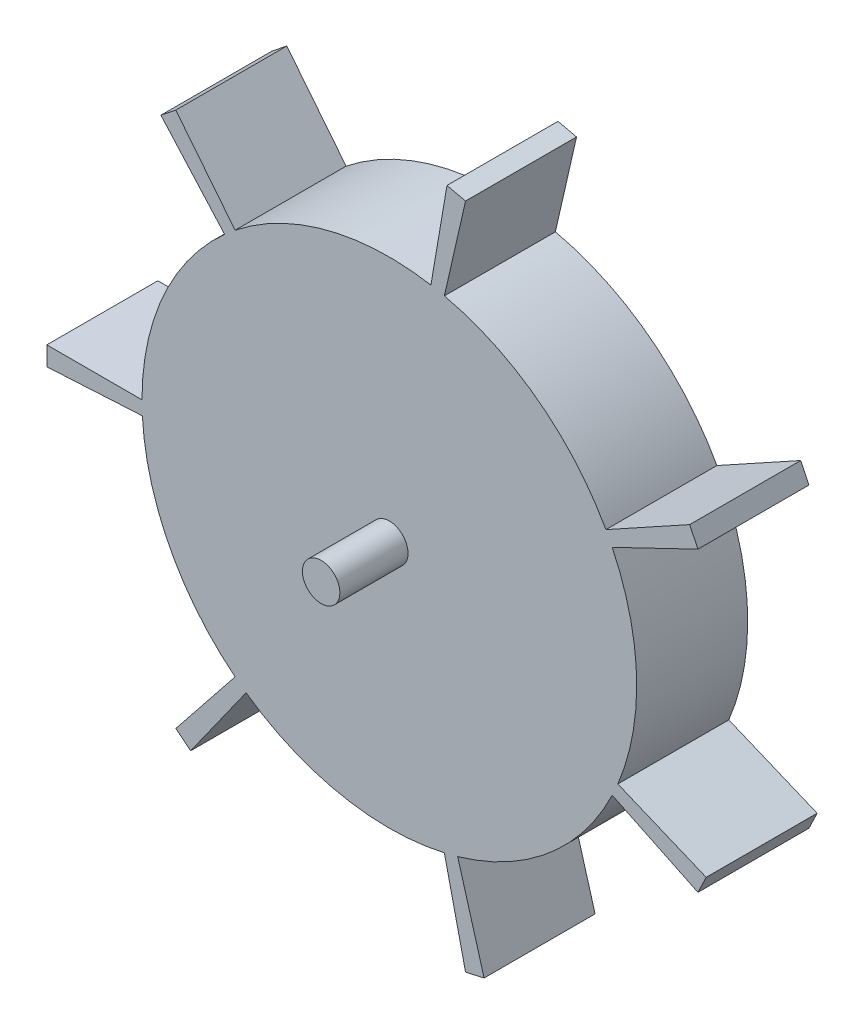
ISO-10303-21;
HEADER;
FILE_DESCRIPTION(('STEP AP214'),'2;1');
FILE_NAME('part.step','',(''),(''),'','','');
FILE_SCHEMA(('AUTOMOTIVE_DESIGN { 1 0 10303 214 1 1 1 1 }'));
ENDSEC;
DATA;
#1=APPLICATION_CONTEXT('core data for automotive mechanical design processes');
#2=APPLICATION_PROTOCOL_DEFINITION('international standard','automotive_design',2000,#1);
#3=PRODUCT_CONTEXT('',#1,'mechanical');
#4=PRODUCT('Part','Part','',(#3));
#5=PRODUCT_RELATED_PRODUCT_CATEGORY('part','',(#4));
#6=PRODUCT_DEFINITION_FORMATION('','',#4);
#7=PRODUCT_DEFINITION_CONTEXT('part definition',#1,'design');
#8=PRODUCT_DEFINITION('design','',#6,#7);
#9=PRODUCT_DEFINITION_SHAPE('','',#8);
#10=(LENGTH_UNIT() NAMED_UNIT(*) SI_UNIT(.MILLI.,.METRE.));
#11=(NAMED_UNIT(*) PLANE_ANGLE_UNIT() SI_UNIT($,.RADIAN.));
#12=(NAMED_UNIT(*) SI_UNIT($,.STERADIAN.) SOLID_ANGLE_UNIT());
#13=UNCERTAINTY_MEASURE_WITH_UNIT(LENGTH_MEASURE(1.E-05),#10,'distance_accuracy_value','');
#14=(GEOMETRIC_REPRESENTATION_CONTEXT(3) GLOBAL_UNCERTAINTY_ASSIGNED_CONTEXT((#13)) GLOBAL_UNIT_ASSIGNED_CONTEXT((#10,
#11,#12)) REPRESENTATION_CONTEXT('',''));
#15=CARTESIAN_POINT('',(0.,0.,0.));
#16=DIRECTION('',(0.,0.,1.));
#17=DIRECTION('',(1.,0.,0.));
#18=AXIS2_PLACEMENT_3D('',#15,#16,#17);
#19=CARTESIAN_POINT('',(0.,0.,-10.75));
#20=DIRECTION('',(0.,0.,1.));
#21=DIRECTION('',(1.,0.,0.));
#22=AXIS2_PLACEMENT_3D('',#19,#20,#21);
#23=PLANE('',#22);
#24=CARTESIAN_POINT('',(0.,0.,-10.75));
#25=DIRECTION('',(0.,0.,1.));
#26=DIRECTION('',(1.,0.,0.));
#27=AXIS2_PLACEMENT_3D('',#24,#25,#26);
#28=CIRCLE('',#27,2.95);
#29=CARTESIAN_POINT('',(2.95,0.,-10.75));
#30=VERTEX_POINT('',#29);
#31=EDGE_CURVE('E582',#30,#30,#28,.T.);
#32=ORIENTED_EDGE('',*,*,#31,.F.);
#33=EDGE_LOOP('',(#32));
#34=FACE_BOUND('',#33,.T.);
#35=CARTESIAN_POINT('',(0.,0.,-10.75));
#36=DIRECTION('',(0.,0.,1.));
#37=DIRECTION('',(1.,0.,0.));
#38=AXIS2_PLACEMENT_3D('',#35,#36,#37);
#39=CIRCLE('',#38,1.7);
#40=CARTESIAN_POINT('',(1.22376468326227,-1.18,-10.75));
#41=VERTEX_POINT('',#40);
#42=CARTESIAN_POINT('',(-1.22376468326227,-1.18,-10.75));
#43=VERTEX_POINT('',#42);
#44=EDGE_CURVE('E56',#41,#43,#39,.T.);
#45=ORIENTED_EDGE('',*,*,#44,.T.);
#46=DIRECTION('',(-1.,0.,0.));
#47=VECTOR('',#46,1.);
#48=CARTESIAN_POINT('',(0.,-1.18,-10.75));
#49=LINE('',#48,#47);
#50=EDGE_CURVE('E597',#41,#43,#49,.T.);
#51=ORIENTED_EDGE('',*,*,#50,.F.);
#52=EDGE_LOOP('',(#45,#51));
#53=FACE_BOUND('',#52,.T.);
#54=ADVANCED_FACE('F41',(#34,#53),#23,.F.);
#55=CARTESIAN_POINT('',(0.,0.,17.5));
#56=DIRECTION('',(0.,0.,-1.));
#57=DIRECTION('',(-1.,0.,0.));
#58=AXIS2_PLACEMENT_3D('',#55,#56,#57);
#59=CYLINDRICAL_SURFACE('',#58,39.);
#60=CARTESIAN_POINT('',(0.,0.,0.));
#61=DIRECTION('',(0.,0.,1.));
#62=DIRECTION('',(1.,0.,0.));
#63=AXIS2_PLACEMENT_3D('',#60,#61,#62);
#64=CIRCLE('',#63,39.);
#65=CARTESIAN_POINT('',(36.0223201102337,-14.9463190744763,0.));
#66=VERTEX_POINT('',#65);
#67=CARTESIAN_POINT('',(35.1377858481946,16.9214658255849,0.));
#68=VERTEX_POINT('',#67);
#69=EDGE_CURVE('E271',#66,#68,#64,.T.);
#70=ORIENTED_EDGE('',*,*,#69,.T.);
#71=DIRECTION('',(0.,0.,-1.));
#72=VECTOR('',#71,1.);
#73=CARTESIAN_POINT('',(35.1377858481946,16.9214658255849,17.5));
#74=LINE('',#73,#72);
#75=CARTESIAN_POINT('',(35.1377858481946,16.9214658255849,17.5));
#76=VERTEX_POINT('',#75);
#77=EDGE_CURVE('E49',#76,#68,#74,.T.);
#78=ORIENTED_EDGE('',*,*,#77,.F.);
#79=CARTESIAN_POINT('',(0.,0.,17.5));
#80=DIRECTION('',(0.,0.,1.));
#81=DIRECTION('',(1.,0.,0.));
#82=AXIS2_PLACEMENT_3D('',#79,#80,#81);
#83=CIRCLE('',#82,39.);
#84=CARTESIAN_POINT('',(36.0223201102337,-14.9463190744763,17.5));
#85=VERTEX_POINT('',#84);
#86=EDGE_CURVE('E321',#85,#76,#83,.T.);
#87=ORIENTED_EDGE('',*,*,#86,.F.);
#88=DIRECTION('',(0.,0.,-1.));
#89=VECTOR('',#88,1.);
#90=CARTESIAN_POINT('',(36.0223201102337,-14.9463190744763,17.5));
#91=LINE('',#90,#89);
#92=EDGE_CURVE('E267',#85,#66,#91,.T.);
#93=ORIENTED_EDGE('',*,*,#92,.T.);
#94=EDGE_LOOP('',(#70,#78,#87,#93));
#95=FACE_BOUND('',#94,.T.);
#96=ADVANCED_FACE('F397',(#95),#59,.T.);
#97=CARTESIAN_POINT('',(0.,0.,17.5));
#98=DIRECTION('',(-0.433883739117559,0.900968867902419,0.));
#99=DIRECTION('',(-0.900968867902419,-0.433883739117559,0.));
#100=AXIS2_PLACEMENT_3D('',#97,#98,#99);
#101=PLANE('',#100);
#102=DIRECTION('',(0.900968867902419,0.433883739117559,0.));
#103=VECTOR('',#102,1.);
#104=CARTESIAN_POINT('',(0.,0.,0.));
#105=LINE('',#104,#103);
#106=CARTESIAN_POINT('',(48.6523188667311,23.4297219123581,0.));
#107=VERTEX_POINT('',#106);
#108=EDGE_CURVE('E274',#68,#107,#105,.T.);
#109=ORIENTED_EDGE('',*,*,#108,.T.);
#110=DIRECTION('',(0.,0.,-1.));
#111=VECTOR('',#110,1.);
#112=CARTESIAN_POINT('',(48.6523188667311,23.4297219123581,17.5));
#113=LINE('',#112,#111);
#114=CARTESIAN_POINT('',(48.6523188667311,23.4297219123581,17.5));
#115=VERTEX_POINT('',#114);
#116=EDGE_CURVE('E391',#115,#107,#113,.T.);
#117=ORIENTED_EDGE('',*,*,#116,.F.);
#118=DIRECTION('',(0.900968867902419,0.433883739117559,0.));
#119=VECTOR('',#118,1.);
#120=CARTESIAN_POINT('',(0.,0.,17.5));
#121=LINE('',#120,#119);
#122=EDGE_CURVE('E167',#76,#115,#121,.T.);
#123=ORIENTED_EDGE('',*,*,#122,.F.);
#124=ORIENTED_EDGE('',*,*,#77,.T.);
#125=EDGE_LOOP('',(#109,#117,#123,#124));
#126=FACE_BOUND('',#125,.T.);
#127=ADVANCED_FACE('F43',(#126),#101,.F.);
#128=CARTESIAN_POINT('',(48.6523188667349,23.4297219123501,17.5));
#129=DIRECTION('',(-0.900968867902419,-0.433883739117558,0.));
#130=DIRECTION('',(0.433883739117558,-0.900968867902419,0.));
#131=AXIS2_PLACEMENT_3D('',#128,#129,#130);
#132=PLANE('',#131);
#133=DIRECTION('',(-0.433883739117558,0.900968867902419,0.));
#134=VECTOR('',#133,1.);
#135=CARTESIAN_POINT('',(48.6523188667349,23.4297219123501,0.));
#136=LINE('',#135,#134);
#137=CARTESIAN_POINT('',(47.3506676493784,26.1326285160653,0.));
#138=VERTEX_POINT('',#137);
#139=EDGE_CURVE('E279',#107,#138,#136,.T.);
#140=ORIENTED_EDGE('',*,*,#139,.T.);
#141=DIRECTION('',(0.,0.,-1.));
#142=VECTOR('',#141,1.);
#143=CARTESIAN_POINT('',(47.3506676493784,26.1326285160653,17.5));
#144=LINE('',#143,#142);
#145=CARTESIAN_POINT('',(47.3506676493784,26.1326285160653,17.5));
#146=VERTEX_POINT('',#145);
#147=EDGE_CURVE('E388',#146,#138,#144,.T.);
#148=ORIENTED_EDGE('',*,*,#147,.F.);
#149=DIRECTION('',(-0.433883739117558,0.900968867902419,0.));
#150=VECTOR('',#149,1.);
#151=CARTESIAN_POINT('',(48.6523188667349,23.4297219123501,17.5));
#152=LINE('',#151,#150);
#153=EDGE_CURVE('E414',#115,#146,#152,.T.);
#154=ORIENTED_EDGE('',*,*,#153,.F.);
#155=ORIENTED_EDGE('',*,*,#116,.T.);
#156=EDGE_LOOP('',(#140,#148,#154,#155));
#157=FACE_BOUND('',#156,.T.);
#158=ADVANCED_FACE('F405',(#157),#132,.F.);
#159=CARTESIAN_POINT('',(0.,0.,17.5));
#160=DIRECTION('',(0.483192472191232,-0.875514154550185,0.));
#161=DIRECTION('',(0.875514154550185,0.483192472191232,0.));
#162=AXIS2_PLACEMENT_3D('',#159,#160,#161);
#163=PLANE('',#162);
#164=DIRECTION('',(-0.875514154550185,-0.483192472191232,0.));
#165=VECTOR('',#164,1.);
#166=CARTESIAN_POINT('',(0.,0.,0.));
#167=LINE('',#166,#165);
#168=CARTESIAN_POINT('',(34.1450520274574,18.8445064154582,0.));
#169=VERTEX_POINT('',#168);
#170=EDGE_CURVE('E281',#138,#169,#167,.T.);
#171=ORIENTED_EDGE('',*,*,#170,.T.);
#172=DIRECTION('',(0.,0.,-1.));
#173=VECTOR('',#172,1.);
#174=CARTESIAN_POINT('',(34.1450520274574,18.8445064154582,17.5));
#175=LINE('',#174,#173);
#176=CARTESIAN_POINT('',(34.1450520274574,18.8445064154582,17.5));
#177=VERTEX_POINT('',#176);
#178=EDGE_CURVE('E385',#177,#169,#175,.T.);
#179=ORIENTED_EDGE('',*,*,#178,.F.);
#180=DIRECTION('',(-0.875514154550185,-0.483192472191232,0.));
#181=VECTOR('',#180,1.);
#182=CARTESIAN_POINT('',(0.,0.,17.5));
#183=LINE('',#182,#181);
#184=EDGE_CURVE('E411',#146,#177,#183,.T.);
#185=ORIENTED_EDGE('',*,*,#184,.F.);
#186=ORIENTED_EDGE('',*,*,#147,.T.);
#187=EDGE_LOOP('',(#171,#179,#185,#186));
#188=FACE_BOUND('',#187,.T.);
#189=ADVANCED_FACE('F409',(#188),#163,.F.);
#190=CARTESIAN_POINT('',(8.67831642429708,38.0221885750948,0.));
#191=VERTEX_POINT('',#190);
#192=EDGE_CURVE('E277',#169,#191,#64,.T.);
#193=ORIENTED_EDGE('',*,*,#192,.T.);
#194=DIRECTION('',(0.,0.,-1.));
#195=VECTOR('',#194,1.);
#196=CARTESIAN_POINT('',(8.67831642429708,38.0221885750948,17.5));
#197=LINE('',#196,#195);
#198=CARTESIAN_POINT('',(8.67831642429708,38.0221885750948,17.5));
#199=VERTEX_POINT('',#198);
#200=EDGE_CURVE('E382',#199,#191,#197,.T.);
#201=ORIENTED_EDGE('',*,*,#200,.F.);
#202=EDGE_CURVE('E413',#177,#199,#83,.T.);
#203=ORIENTED_EDGE('',*,*,#202,.F.);
#204=ORIENTED_EDGE('',*,*,#178,.T.);
#205=EDGE_LOOP('',(#193,#201,#203,#204));
#206=FACE_BOUND('',#205,.T.);
#207=ADVANCED_FACE('F556',(#206),#59,.T.);
#208=CARTESIAN_POINT('',(0.,0.,17.5));
#209=DIRECTION('',(-0.974927912181824,0.222520933956314,0.));
#210=DIRECTION('',(-0.222520933956314,-0.974927912181824,0.));
#211=AXIS2_PLACEMENT_3D('',#208,#209,#210);
#212=PLANE('',#211);
#213=DIRECTION('',(0.222520933956314,0.974927912181824,0.));
#214=VECTOR('',#213,1.);
#215=CARTESIAN_POINT('',(0.,0.,0.));
#216=LINE('',#215,#214);
#217=CARTESIAN_POINT('',(12.0161304336378,52.6461072578258,0.));
#218=VERTEX_POINT('',#217);
#219=EDGE_CURVE('E283',#191,#218,#216,.T.);
#220=ORIENTED_EDGE('',*,*,#219,.T.);
#221=DIRECTION('',(0.,0.,-1.));
#222=VECTOR('',#221,1.);
#223=CARTESIAN_POINT('',(12.0161304336378,52.6461072578258,17.5));
#224=LINE('',#223,#222);
#225=CARTESIAN_POINT('',(12.0161304336378,52.6461072578258,17.5));
#226=VERTEX_POINT('',#225);
#227=EDGE_CURVE('E379',#226,#218,#224,.T.);
#228=ORIENTED_EDGE('',*,*,#227,.F.);
#229=DIRECTION('',(0.222520933956314,0.974927912181824,0.));
#230=VECTOR('',#229,1.);
#231=CARTESIAN_POINT('',(0.,0.,17.5));
#232=LINE('',#231,#230);
#233=EDGE_CURVE('E416',#199,#226,#232,.T.);
#234=ORIENTED_EDGE('',*,*,#233,.F.);
#235=ORIENTED_EDGE('',*,*,#200,.T.);
#236=EDGE_LOOP('',(#220,#228,#234,#235));
#237=FACE_BOUND('',#236,.T.);
#238=ADVANCED_FACE('F843',(#237),#212,.F.);
#239=CARTESIAN_POINT('',(12.0161304336424,52.6461072578248,17.5));
#240=DIRECTION('',(-0.222520933956314,-0.974927912181824,0.));
#241=DIRECTION('',(0.974927912181824,-0.222520933956314,0.));
#242=AXIS2_PLACEMENT_3D('',#239,#240,#241);
#243=PLANE('',#242);
#244=DIRECTION('',(-0.974927912181824,0.222520933956314,0.));
#245=VECTOR('',#244,1.);
#246=CARTESIAN_POINT('',(12.0161304336424,52.6461072578248,0.));
#247=LINE('',#246,#245);
#248=CARTESIAN_POINT('',(9.09134669709236,53.3136700596948,0.));
#249=VERTEX_POINT('',#248);
#250=EDGE_CURVE('E285',#218,#249,#247,.T.);
#251=ORIENTED_EDGE('',*,*,#250,.T.);
#252=DIRECTION('',(0.,0.,-1.));
#253=VECTOR('',#252,1.);
#254=CARTESIAN_POINT('',(9.09134669709236,53.3136700596948,17.5));
#255=LINE('',#254,#253);
#256=CARTESIAN_POINT('',(9.09134669709236,53.3136700596948,17.5));
#257=VERTEX_POINT('',#256);
#258=EDGE_CURVE('E376',#257,#249,#255,.T.);
#259=ORIENTED_EDGE('',*,*,#258,.F.);
#260=DIRECTION('',(-0.974927912181824,0.222520933956314,0.));
#261=VECTOR('',#260,1.);
#262=CARTESIAN_POINT('',(12.0161304336424,52.6461072578248,17.5));
#263=LINE('',#262,#261);
#264=EDGE_CURVE('E423',#226,#257,#263,.T.);
#265=ORIENTED_EDGE('',*,*,#264,.F.);
#266=ORIENTED_EDGE('',*,*,#227,.T.);
#267=EDGE_LOOP('',(#251,#259,#265,#266));
#268=FACE_BOUND('',#267,.T.);
#269=ADVANCED_FACE('F832',(#268),#243,.F.);
#270=CARTESIAN_POINT('',(0.,0.,17.5));
#271=DIRECTION('',(0.985770108119858,-0.168099059894349,0.));
#272=DIRECTION('',(0.168099059894349,0.985770108119858,0.));
#273=AXIS2_PLACEMENT_3D('',#270,#271,#272);
#274=PLANE('',#273);
#275=DIRECTION('',(-0.168099059894349,-0.985770108119858,0.));
#276=VECTOR('',#275,1.);
#277=CARTESIAN_POINT('',(0.,0.,0.));
#278=LINE('',#277,#276);
#279=CARTESIAN_POINT('',(6.55586333588022,38.4450342166781,0.));
#280=VERTEX_POINT('',#279);
#281=EDGE_CURVE('E287',#249,#280,#278,.T.);
#282=ORIENTED_EDGE('',*,*,#281,.T.);
#283=DIRECTION('',(0.,0.,-1.));
#284=VECTOR('',#283,1.);
#285=CARTESIAN_POINT('',(6.55586333588022,38.4450342166781,17.5));
#286=LINE('',#285,#284);
#287=CARTESIAN_POINT('',(6.55586333588022,38.4450342166781,17.5));
#288=VERTEX_POINT('',#287);
#289=EDGE_CURVE('E373',#288,#280,#286,.T.);
#290=ORIENTED_EDGE('',*,*,#289,.F.);
#291=DIRECTION('',(-0.168099059894349,-0.985770108119858,0.));
#292=VECTOR('',#291,1.);
#293=CARTESIAN_POINT('',(0.,0.,17.5));
#294=LINE('',#293,#292);
#295=EDGE_CURVE('E425',#257,#288,#294,.T.);
#296=ORIENTED_EDGE('',*,*,#295,.F.);
#297=ORIENTED_EDGE('',*,*,#258,.T.);
#298=EDGE_LOOP('',(#282,#290,#296,#297));
#299=FACE_BOUND('',#298,.T.);
#300=ADVANCED_FACE('F823',(#299),#274,.F.);
#301=CARTESIAN_POINT('',(-24.3161022724918,30.4914278162546,0.));
#302=VERTEX_POINT('',#301);
#303=EDGE_CURVE('E289',#280,#302,#64,.T.);
#304=ORIENTED_EDGE('',*,*,#303,.T.);
#305=DIRECTION('',(0.,0.,-1.));
#306=VECTOR('',#305,1.);
#307=CARTESIAN_POINT('',(-24.3161022724918,30.4914278162546,17.5));
#308=LINE('',#307,#306);
#309=CARTESIAN_POINT('',(-24.3161022724918,30.4914278162546,17.5));
#310=VERTEX_POINT('',#309);
#311=EDGE_CURVE('E370',#310,#302,#308,.T.);
#312=ORIENTED_EDGE('',*,*,#311,.F.);
#313=EDGE_CURVE('E418',#288,#310,#83,.T.);
#314=ORIENTED_EDGE('',*,*,#313,.F.);
#315=ORIENTED_EDGE('',*,*,#289,.T.);
#316=EDGE_LOOP('',(#304,#312,#314,#315));
#317=FACE_BOUND('',#316,.T.);
#318=ADVANCED_FACE('F468',(#317),#59,.T.);
#319=CARTESIAN_POINT('',(0.,0.,17.5));
#320=DIRECTION('',(-0.781831482468029,-0.623489801858734,0.));
#321=DIRECTION('',(0.623489801858734,-0.781831482468029,0.));
#322=AXIS2_PLACEMENT_3D('',#319,#320,#321);
#323=PLANE('',#322);
#324=DIRECTION('',(-0.623489801858734,0.781831482468029,0.));
#325=VECTOR('',#324,1.);
#326=CARTESIAN_POINT('',(0.,0.,0.));
#327=LINE('',#326,#325);
#328=CARTESIAN_POINT('',(-33.668449300375,42.2189000532765,0.));
#329=VERTEX_POINT('',#328);
#330=EDGE_CURVE('E290',#302,#329,#327,.T.);
#331=ORIENTED_EDGE('',*,*,#330,.T.);
#332=DIRECTION('',(0.,0.,-1.));
#333=VECTOR('',#332,1.);
#334=CARTESIAN_POINT('',(-33.668449300375,42.2189000532765,17.5));
#335=LINE('',#334,#333);
#336=CARTESIAN_POINT('',(-33.668449300375,42.2189000532765,17.5));
#337=VERTEX_POINT('',#336);
#338=EDGE_CURVE('E367',#337,#329,#335,.T.);
#339=ORIENTED_EDGE('',*,*,#338,.F.);
#340=DIRECTION('',(-0.623489801858734,0.781831482468029,0.));
#341=VECTOR('',#340,1.);
#342=CARTESIAN_POINT('',(0.,0.,17.5));
#343=LINE('',#342,#341);
#344=EDGE_CURVE('E427',#310,#337,#343,.T.);
#345=ORIENTED_EDGE('',*,*,#344,.F.);
#346=ORIENTED_EDGE('',*,*,#311,.T.);
#347=EDGE_LOOP('',(#331,#339,#345,#346));
#348=FACE_BOUND('',#347,.T.);
#349=ADVANCED_FACE('F472',(#348),#323,.F.);
#350=CARTESIAN_POINT('',(-33.6684493003744,42.2189000532769,17.5));
#351=DIRECTION('',(0.623489801858735,-0.781831482468028,0.));
#352=DIRECTION('',(0.781831482468028,0.623489801858735,0.));
#353=AXIS2_PLACEMENT_3D('',#350,#351,#352);
#354=PLANE('',#353);
#355=DIRECTION('',(-0.781831482468028,-0.623489801858735,0.));
#356=VECTOR('',#355,1.);
#357=CARTESIAN_POINT('',(-33.6684493003744,42.2189000532769,0.));
#358=LINE('',#357,#356);
#359=CARTESIAN_POINT('',(-36.013943747779,40.3484306477003,0.));
#360=VERTEX_POINT('',#359);
#361=EDGE_CURVE('E292',#329,#360,#358,.T.);
#362=ORIENTED_EDGE('',*,*,#361,.T.);
#363=DIRECTION('',(0.,0.,-1.));
#364=VECTOR('',#363,1.);
#365=CARTESIAN_POINT('',(-36.013943747779,40.3484306477003,17.5));
#366=LINE('',#365,#364);
#367=CARTESIAN_POINT('',(-36.013943747779,40.3484306477003,17.5));
#368=VERTEX_POINT('',#367);
#369=EDGE_CURVE('E364',#368,#360,#366,.T.);
#370=ORIENTED_EDGE('',*,*,#369,.F.);
#371=DIRECTION('',(-0.781831482468028,-0.623489801858735,0.));
#372=VECTOR('',#371,1.);
#373=CARTESIAN_POINT('',(-33.6684493003744,42.2189000532769,17.5));
#374=LINE('',#373,#372);
#375=EDGE_CURVE('E429',#337,#368,#374,.T.);
#376=ORIENTED_EDGE('',*,*,#375,.F.);
#377=ORIENTED_EDGE('',*,*,#338,.T.);
#378=EDGE_LOOP('',(#362,#370,#376,#377));
#379=FACE_BOUND('',#378,.T.);
#380=ADVANCED_FACE('F477',(#379),#354,.F.);
#381=CARTESIAN_POINT('',(0.,0.,17.5));
#382=DIRECTION('',(0.746042746588593,0.665898055457852,0.));
#383=DIRECTION('',(-0.665898055457852,0.746042746588593,0.));
#384=AXIS2_PLACEMENT_3D('',#381,#382,#383);
#385=PLANE('',#384);
#386=DIRECTION('',(0.665898055457852,-0.746042746588593,0.));
#387=VECTOR('',#386,1.);
#388=CARTESIAN_POINT('',(0.,0.,0.));
#389=LINE('',#388,#387);
#390=CARTESIAN_POINT('',(-25.9700241628575,29.0956671169566,0.));
#391=VERTEX_POINT('',#390);
#392=EDGE_CURVE('E294',#360,#391,#389,.T.);
#393=ORIENTED_EDGE('',*,*,#392,.T.);
#394=DIRECTION('',(0.,0.,-1.));
#395=VECTOR('',#394,1.);
#396=CARTESIAN_POINT('',(-25.9700241628575,29.0956671169566,17.5));
#397=LINE('',#396,#395);
#398=CARTESIAN_POINT('',(-25.9700241628575,29.0956671169566,17.5));
#399=VERTEX_POINT('',#398);
#400=EDGE_CURVE('E361',#399,#391,#397,.T.);
#401=ORIENTED_EDGE('',*,*,#400,.F.);
#402=DIRECTION('',(0.665898055457852,-0.746042746588593,0.));
#403=VECTOR('',#402,1.);
#404=CARTESIAN_POINT('',(0.,0.,17.5));
#405=LINE('',#404,#403);
#406=EDGE_CURVE('E431',#368,#399,#405,.T.);
#407=ORIENTED_EDGE('',*,*,#406,.F.);
#408=ORIENTED_EDGE('',*,*,#369,.T.);
#409=EDGE_LOOP('',(#393,#401,#407,#408));
#410=FACE_BOUND('',#409,.T.);
#411=ADVANCED_FACE('F481',(#410),#385,.F.);
#412=CARTESIAN_POINT('',(-39.,0.,0.));
#413=VERTEX_POINT('',#412);
#414=EDGE_CURVE('E296',#391,#413,#64,.T.);
#415=ORIENTED_EDGE('',*,*,#414,.T.);
#416=DIRECTION('',(0.,0.,-1.));
#417=VECTOR('',#416,1.);
#418=CARTESIAN_POINT('',(-39.,0.,17.5));
#419=LINE('',#418,#417);
#420=CARTESIAN_POINT('',(-39.,0.,17.5));
#421=VERTEX_POINT('',#420);
#422=EDGE_CURVE('E358',#421,#413,#419,.T.);
#423=ORIENTED_EDGE('',*,*,#422,.F.);
#424=EDGE_CURVE('E433',#399,#421,#83,.T.);
#425=ORIENTED_EDGE('',*,*,#424,.F.);
#426=ORIENTED_EDGE('',*,*,#400,.T.);
#427=EDGE_LOOP('',(#415,#423,#425,#426));
#428=FACE_BOUND('',#427,.T.);
#429=ADVANCED_FACE('F485',(#428),#59,.T.);
#430=CARTESIAN_POINT('',(0.,0.,17.5));
#431=DIRECTION('',(0.,-1.,0.));
#432=DIRECTION('',(1.,0.,0.));
#433=AXIS2_PLACEMENT_3D('',#430,#431,#432);
#434=PLANE('',#433);
#435=DIRECTION('',(-1.,0.,0.));
#436=VECTOR('',#435,1.);
#437=CARTESIAN_POINT('',(0.,0.,0.));
#438=LINE('',#437,#436);
#439=CARTESIAN_POINT('',(-54.,0.,0.));
#440=VERTEX_POINT('',#439);
#441=EDGE_CURVE('E297',#413,#440,#438,.T.);
#442=ORIENTED_EDGE('',*,*,#441,.T.);
#443=DIRECTION('',(0.,0.,-1.));
#444=VECTOR('',#443,1.);
#445=CARTESIAN_POINT('',(-54.,0.,17.5));
#446=LINE('',#445,#444);
#447=CARTESIAN_POINT('',(-54.,0.,17.5));
#448=VERTEX_POINT('',#447);
#449=EDGE_CURVE('E355',#448,#440,#446,.T.);
#450=ORIENTED_EDGE('',*,*,#449,.F.);
#451=DIRECTION('',(-1.,0.,0.));
#452=VECTOR('',#451,1.);
#453=CARTESIAN_POINT('',(0.,0.,17.5));
#454=LINE('',#453,#452);
#455=EDGE_CURVE('E434',#421,#448,#454,.T.);
#456=ORIENTED_EDGE('',*,*,#455,.F.);
#457=ORIENTED_EDGE('',*,*,#422,.T.);
#458=EDGE_LOOP('',(#442,#450,#456,#457));
#459=FACE_BOUND('',#458,.T.);
#460=ADVANCED_FACE('F490',(#459),#434,.F.);
#461=CARTESIAN_POINT('',(-54.,0.,17.5));
#462=DIRECTION('',(1.,0.,0.));
#463=DIRECTION('',(0.,0.,-1.));
#464=AXIS2_PLACEMENT_3D('',#461,#462,#463);
#465=PLANE('',#464);
#466=DIRECTION('',(0.,-1.,0.));
#467=VECTOR('',#466,1.);
#468=CARTESIAN_POINT('',(-54.,0.,0.));
#469=LINE('',#468,#467);
#470=CARTESIAN_POINT('',(-54.,-3.,0.));
#471=VERTEX_POINT('',#470);
#472=EDGE_CURVE('E299',#440,#471,#469,.T.);
#473=ORIENTED_EDGE('',*,*,#472,.T.);
#474=DIRECTION('',(0.,0.,-1.));
#475=VECTOR('',#474,1.);
#476=CARTESIAN_POINT('',(-54.,-3.,17.5));
#477=LINE('',#476,#475);
#478=CARTESIAN_POINT('',(-54.,-3.,17.5));
#479=VERTEX_POINT('',#478);
#480=EDGE_CURVE('E352',#479,#471,#477,.T.);
#481=ORIENTED_EDGE('',*,*,#480,.F.);
#482=DIRECTION('',(0.,-1.,0.));
#483=VECTOR('',#482,1.);
#484=CARTESIAN_POINT('',(-54.,0.,17.5));
#485=LINE('',#484,#483);
#486=EDGE_CURVE('E436',#448,#479,#485,.T.);
#487=ORIENTED_EDGE('',*,*,#486,.F.);
#488=ORIENTED_EDGE('',*,*,#449,.T.);
#489=EDGE_LOOP('',(#473,#481,#487,#488));
#490=FACE_BOUND('',#489,.T.);
#491=ADVANCED_FACE('F496',(#490),#465,.F.);
#492=CARTESIAN_POINT('',(0.,0.,17.5));
#493=DIRECTION('',(-0.055470019622523,0.998460353205412,0.));
#494=DIRECTION('',(-0.998460353205412,-0.055470019622523,0.));
#495=AXIS2_PLACEMENT_3D('',#492,#493,#494);
#496=PLANE('',#495);
#497=DIRECTION('',(0.998460353205413,0.055470019622523,0.));
#498=VECTOR('',#497,1.);
#499=CARTESIAN_POINT('',(0.,0.,0.));
#500=LINE('',#499,#498);
#501=CARTESIAN_POINT('',(-38.9399537750111,-2.1633307652784,0.));
#502=VERTEX_POINT('',#501);
#503=EDGE_CURVE('E301',#471,#502,#500,.T.);
#504=ORIENTED_EDGE('',*,*,#503,.T.);
#505=DIRECTION('',(0.,0.,-1.));
#506=VECTOR('',#505,1.);
#507=CARTESIAN_POINT('',(-38.9399537750111,-2.1633307652784,17.5));
#508=LINE('',#507,#506);
#509=CARTESIAN_POINT('',(-38.9399537750111,-2.1633307652784,17.5));
#510=VERTEX_POINT('',#509);
#511=EDGE_CURVE('E349',#510,#502,#508,.T.);
#512=ORIENTED_EDGE('',*,*,#511,.F.);
#513=DIRECTION('',(0.998460353205413,0.055470019622523,0.));
#514=VECTOR('',#513,1.);
#515=CARTESIAN_POINT('',(0.,0.,17.5));
#516=LINE('',#515,#514);
#517=EDGE_CURVE('E438',#479,#510,#516,.T.);
#518=ORIENTED_EDGE('',*,*,#517,.F.);
#519=ORIENTED_EDGE('',*,*,#480,.T.);
#520=EDGE_LOOP('',(#504,#512,#518,#519));
#521=FACE_BOUND('',#520,.T.);
#522=ADVANCED_FACE('F500',(#521),#496,.F.);
#523=CARTESIAN_POINT('',(-24.3161022724903,-30.4914278162528,0.));
#524=VERTEX_POINT('',#523);
#525=EDGE_CURVE('E303',#502,#524,#64,.T.);
#526=ORIENTED_EDGE('',*,*,#525,.T.);
#527=DIRECTION('',(0.,0.,-1.));
#528=VECTOR('',#527,1.);
#529=CARTESIAN_POINT('',(-24.3161022724903,-30.4914278162528,17.5));
#530=LINE('',#529,#528);
#531=CARTESIAN_POINT('',(-24.3161022724903,-30.4914278162528,17.5));
#532=VERTEX_POINT('',#531);
#533=EDGE_CURVE('E346',#532,#524,#530,.T.);
#534=ORIENTED_EDGE('',*,*,#533,.F.);
#535=EDGE_CURVE('E440',#510,#532,#83,.T.);
#536=ORIENTED_EDGE('',*,*,#535,.F.);
#537=ORIENTED_EDGE('',*,*,#511,.T.);
#538=EDGE_LOOP('',(#526,#534,#536,#537));
#539=FACE_BOUND('',#538,.T.);
#540=ADVANCED_FACE('F503',(#539),#59,.T.);
#541=CARTESIAN_POINT('',(0.,0.,17.5));
#542=DIRECTION('',(0.78183148246803,-0.623489801858733,0.));
#543=DIRECTION('',(0.623489801858733,0.78183148246803,0.));
#544=AXIS2_PLACEMENT_3D('',#541,#542,#543);
#545=PLANE('',#544);
#546=DIRECTION('',(-0.623489801858733,-0.78183148246803,0.));
#547=VECTOR('',#546,1.);
#548=CARTESIAN_POINT('',(0.,0.,0.));
#549=LINE('',#548,#547);
#550=CARTESIAN_POINT('',(-33.6684493003672,-42.2189000532728,0.));
#551=VERTEX_POINT('',#550);
#552=EDGE_CURVE('E304',#524,#551,#549,.T.);
#553=ORIENTED_EDGE('',*,*,#552,.T.);
#554=DIRECTION('',(0.,0.,-1.));
#555=VECTOR('',#554,1.);
#556=CARTESIAN_POINT('',(-33.6684493003672,-42.2189000532728,17.5));
#557=LINE('',#556,#555);
#558=CARTESIAN_POINT('',(-33.6684493003672,-42.2189000532728,17.5));
#559=VERTEX_POINT('',#558);
#560=EDGE_CURVE('E343',#559,#551,#557,.T.);
#561=ORIENTED_EDGE('',*,*,#560,.F.);
#562=DIRECTION('',(-0.623489801858733,-0.78183148246803,0.));
#563=VECTOR('',#562,1.);
#564=CARTESIAN_POINT('',(0.,0.,17.5));
#565=LINE('',#564,#563);
#566=EDGE_CURVE('E441',#532,#559,#565,.T.);
#567=ORIENTED_EDGE('',*,*,#566,.F.);
#568=ORIENTED_EDGE('',*,*,#533,.T.);
#569=EDGE_LOOP('',(#553,#561,#567,#568));
#570=FACE_BOUND('',#569,.T.);
#571=ADVANCED_FACE('F508',(#570),#545,.F.);
#572=CARTESIAN_POINT('',(-33.6684493003696,-42.218900053271,17.5));
#573=DIRECTION('',(0.623489801858734,0.781831482468029,0.));
#574=DIRECTION('',(-0.781831482468029,0.623489801858734,0.));
#575=AXIS2_PLACEMENT_3D('',#572,#573,#574);
#576=PLANE('',#575);
#577=DIRECTION('',(0.781831482468029,-0.623489801858734,0.));
#578=VECTOR('',#577,1.);
#579=CARTESIAN_POINT('',(-33.6684493003696,-42.218900053271,0.));
#580=LINE('',#579,#578);
#581=CARTESIAN_POINT('',(-31.3229548529632,-44.089369458849,0.));
#582=VERTEX_POINT('',#581);
#583=EDGE_CURVE('E306',#551,#582,#580,.T.);
#584=ORIENTED_EDGE('',*,*,#583,.T.);
#585=DIRECTION('',(0.,0.,-1.));
#586=VECTOR('',#585,1.);
#587=CARTESIAN_POINT('',(-31.3229548529632,-44.089369458849,17.5));
#588=LINE('',#587,#586);
#589=CARTESIAN_POINT('',(-31.3229548529632,-44.089369458849,17.5));
#590=VERTEX_POINT('',#589);
#591=EDGE_CURVE('E340',#590,#582,#588,.T.);
#592=ORIENTED_EDGE('',*,*,#591,.F.);
#593=DIRECTION('',(0.781831482468029,-0.623489801858734,0.));
#594=VECTOR('',#593,1.);
#595=CARTESIAN_POINT('',(-33.6684493003696,-42.218900053271,17.5));
#596=LINE('',#595,#594);
#597=EDGE_CURVE('E443',#559,#590,#596,.T.);
#598=ORIENTED_EDGE('',*,*,#597,.F.);
#599=ORIENTED_EDGE('',*,*,#560,.T.);
#600=EDGE_LOOP('',(#584,#592,#598,#599));
#601=FACE_BOUND('',#600,.T.);
#602=ADVANCED_FACE('F514',(#601),#576,.F.);
#603=CARTESIAN_POINT('',(0.,0.,17.5));
#604=DIRECTION('',(-0.815212729675688,0.579161640109835,0.));
#605=DIRECTION('',(-0.579161640109835,-0.815212729675688,0.));
#606=AXIS2_PLACEMENT_3D('',#603,#604,#605);
#607=PLANE('',#606);
#608=DIRECTION('',(0.579161640109835,0.815212729675688,0.));
#609=VECTOR('',#608,1.);
#610=CARTESIAN_POINT('',(0.,0.,0.));
#611=LINE('',#610,#609);
#612=CARTESIAN_POINT('',(-22.5873039642833,-31.7932964573514,0.));
#613=VERTEX_POINT('',#612);
#614=EDGE_CURVE('E308',#582,#613,#611,.T.);
#615=ORIENTED_EDGE('',*,*,#614,.T.);
#616=DIRECTION('',(0.,0.,-1.));
#617=VECTOR('',#616,1.);
#618=CARTESIAN_POINT('',(-22.5873039642833,-31.7932964573514,17.5));
#619=LINE('',#618,#617);
#620=CARTESIAN_POINT('',(-22.5873039642833,-31.7932964573514,17.5));
#621=VERTEX_POINT('',#620);
#622=EDGE_CURVE('E337',#621,#613,#619,.T.);
#623=ORIENTED_EDGE('',*,*,#622,.F.);
#624=DIRECTION('',(0.579161640109835,0.815212729675688,0.));
#625=VECTOR('',#624,1.);
#626=CARTESIAN_POINT('',(0.,0.,17.5));
#627=LINE('',#626,#625);
#628=EDGE_CURVE('E445',#590,#621,#627,.T.);
#629=ORIENTED_EDGE('',*,*,#628,.F.);
#630=ORIENTED_EDGE('',*,*,#591,.T.);
#631=EDGE_LOOP('',(#615,#623,#629,#630));
#632=FACE_BOUND('',#631,.T.);
#633=ADVANCED_FACE('F518',(#632),#607,.F.);
#634=CARTESIAN_POINT('',(8.67831642429574,-38.0221885750888,0.));
#635=VERTEX_POINT('',#634);
#636=EDGE_CURVE('E310',#613,#635,#64,.T.);
#637=ORIENTED_EDGE('',*,*,#636,.T.);
#638=DIRECTION('',(0.,0.,-1.));
#639=VECTOR('',#638,1.);
#640=CARTESIAN_POINT('',(8.67831642429574,-38.0221885750888,17.5));
#641=LINE('',#640,#639);
#642=CARTESIAN_POINT('',(8.67831642429574,-38.0221885750888,17.5));
#643=VERTEX_POINT('',#642);
#644=EDGE_CURVE('E334',#643,#635,#641,.T.);
#645=ORIENTED_EDGE('',*,*,#644,.F.);
#646=EDGE_CURVE('E447',#621,#643,#83,.T.);
#647=ORIENTED_EDGE('',*,*,#646,.F.);
#648=ORIENTED_EDGE('',*,*,#622,.T.);
#649=EDGE_LOOP('',(#637,#645,#647,#648));
#650=FACE_BOUND('',#649,.T.);
#651=ADVANCED_FACE('F521',(#650),#59,.T.);
#652=CARTESIAN_POINT('',(0.,0.,17.5));
#653=DIRECTION('',(0.974927912181823,0.222520933956315,0.));
#654=DIRECTION('',(-0.222520933956315,0.974927912181824,0.));
#655=AXIS2_PLACEMENT_3D('',#652,#653,#654);
#656=PLANE('',#655);
#657=DIRECTION('',(0.222520933956315,-0.974927912181824,0.));
#658=VECTOR('',#657,1.);
#659=CARTESIAN_POINT('',(0.,0.,0.));
#660=LINE('',#659,#658);
#661=CARTESIAN_POINT('',(12.0161304336474,-52.6461072578138,0.));
#662=VERTEX_POINT('',#661);
#663=EDGE_CURVE('E311',#635,#662,#660,.T.);
#664=ORIENTED_EDGE('',*,*,#663,.T.);
#665=DIRECTION('',(0.,0.,-1.));
#666=VECTOR('',#665,1.);
#667=CARTESIAN_POINT('',(12.0161304336474,-52.6461072578138,17.5));
#668=LINE('',#667,#666);
#669=CARTESIAN_POINT('',(12.0161304336474,-52.6461072578138,17.5));
#670=VERTEX_POINT('',#669);
#671=EDGE_CURVE('E331',#670,#662,#668,.T.);
#672=ORIENTED_EDGE('',*,*,#671,.F.);
#673=DIRECTION('',(0.222520933956315,-0.974927912181824,0.));
#674=VECTOR('',#673,1.);
#675=CARTESIAN_POINT('',(0.,0.,17.5));
#676=LINE('',#675,#674);
#677=EDGE_CURVE('E448',#643,#670,#676,.T.);
#678=ORIENTED_EDGE('',*,*,#677,.F.);
#679=ORIENTED_EDGE('',*,*,#644,.T.);
#680=EDGE_LOOP('',(#664,#672,#678,#679));
#681=FACE_BOUND('',#680,.T.);
#682=ADVANCED_FACE('F526',(#681),#656,.F.);
#683=CARTESIAN_POINT('',(12.0161304336404,-52.6461072578154,17.5));
#684=DIRECTION('',(-0.222520933956317,0.974927912181823,0.));
#685=DIRECTION('',(-0.974927912181823,-0.222520933956317,0.));
#686=AXIS2_PLACEMENT_3D('',#683,#684,#685);
#687=PLANE('',#686);
#688=DIRECTION('',(0.974927912181823,0.222520933956317,0.));
#689=VECTOR('',#688,1.);
#690=CARTESIAN_POINT('',(12.0161304336404,-52.6461072578154,0.));
#691=LINE('',#690,#689);
#692=CARTESIAN_POINT('',(14.9409141701929,-51.9785444559448,0.));
#693=VERTEX_POINT('',#692);
#694=EDGE_CURVE('E313',#662,#693,#691,.T.);
#695=ORIENTED_EDGE('',*,*,#694,.T.);
#696=DIRECTION('',(0.,0.,-1.));
#697=VECTOR('',#696,1.);
#698=CARTESIAN_POINT('',(14.9409141701929,-51.9785444559448,17.5));
#699=LINE('',#698,#697);
#700=CARTESIAN_POINT('',(14.9409141701929,-51.9785444559448,17.5));
#701=VERTEX_POINT('',#700);
#702=EDGE_CURVE('E328',#701,#693,#699,.T.);
#703=ORIENTED_EDGE('',*,*,#702,.F.);
#704=DIRECTION('',(0.974927912181823,0.222520933956317,0.));
#705=VECTOR('',#704,1.);
#706=CARTESIAN_POINT('',(12.0161304336404,-52.6461072578154,17.5));
#707=LINE('',#706,#705);
#708=EDGE_CURVE('E450',#670,#701,#707,.T.);
#709=ORIENTED_EDGE('',*,*,#708,.F.);
#710=ORIENTED_EDGE('',*,*,#671,.T.);
#711=EDGE_LOOP('',(#695,#703,#709,#710));
#712=FACE_BOUND('',#711,.T.);
#713=ADVANCED_FACE('F530',(#712),#687,.F.);
#714=CARTESIAN_POINT('',(0.,0.,17.5));
#715=DIRECTION('',(-0.9610836269739,-0.276257600732891,0.));
#716=DIRECTION('',(0.276257600732891,-0.9610836269739,0.));
#717=AXIS2_PLACEMENT_3D('',#714,#715,#716);
#718=PLANE('',#717);
#719=DIRECTION('',(-0.276257600732891,0.9610836269739,0.));
#720=VECTOR('',#719,1.);
#721=CARTESIAN_POINT('',(0.,0.,0.));
#722=LINE('',#721,#720);
#723=CARTESIAN_POINT('',(10.7740464285821,-37.4822614519797,0.));
#724=VERTEX_POINT('',#723);
#725=EDGE_CURVE('E315',#693,#724,#722,.T.);
#726=ORIENTED_EDGE('',*,*,#725,.T.);
#727=DIRECTION('',(0.,0.,-1.));
#728=VECTOR('',#727,1.);
#729=CARTESIAN_POINT('',(10.7740464285821,-37.4822614519797,17.5));
#730=LINE('',#729,#728);
#731=CARTESIAN_POINT('',(10.7740464285821,-37.4822614519797,17.5));
#732=VERTEX_POINT('',#731);
#733=EDGE_CURVE('E325',#732,#724,#730,.T.);
#734=ORIENTED_EDGE('',*,*,#733,.F.);
#735=DIRECTION('',(-0.276257600732891,0.9610836269739,0.));
#736=VECTOR('',#735,1.);
#737=CARTESIAN_POINT('',(0.,0.,17.5));
#738=LINE('',#737,#736);
#739=EDGE_CURVE('E451',#701,#732,#738,.T.);
#740=ORIENTED_EDGE('',*,*,#739,.F.);
#741=ORIENTED_EDGE('',*,*,#702,.T.);
#742=EDGE_LOOP('',(#726,#734,#740,#741));
#743=FACE_BOUND('',#742,.T.);
#744=ADVANCED_FACE('F534',(#743),#718,.F.);
#745=CARTESIAN_POINT('',(35.1377858481967,-16.9214658255859,0.));
#746=VERTEX_POINT('',#745);
#747=EDGE_CURVE('E276',#724,#746,#64,.T.);
#748=ORIENTED_EDGE('',*,*,#747,.T.);
#749=DIRECTION('',(0.,0.,-1.));
#750=VECTOR('',#749,1.);
#751=CARTESIAN_POINT('',(35.1377858481967,-16.9214658255859,17.5));
#752=LINE('',#751,#750);
#753=CARTESIAN_POINT('',(35.1377858481967,-16.9214658255859,17.5));
#754=VERTEX_POINT('',#753);
#755=EDGE_CURVE('E262',#754,#746,#752,.T.);
#756=ORIENTED_EDGE('',*,*,#755,.F.);
#757=EDGE_CURVE('E250',#732,#754,#83,.T.);
#758=ORIENTED_EDGE('',*,*,#757,.F.);
#759=ORIENTED_EDGE('',*,*,#733,.T.);
#760=EDGE_LOOP('',(#748,#756,#758,#759));
#761=FACE_BOUND('',#760,.T.);
#762=ADVANCED_FACE('F537',(#761),#59,.T.);
#763=CARTESIAN_POINT('',(0.,0.,17.5));
#764=DIRECTION('',(0.433883739117558,0.900968867902419,0.));
#765=DIRECTION('',(-0.900968867902419,0.433883739117558,0.));
#766=AXIS2_PLACEMENT_3D('',#763,#764,#765);
#767=PLANE('',#766);
#768=DIRECTION('',(0.900968867902419,-0.433883739117558,0.));
#769=VECTOR('',#768,1.);
#770=CARTESIAN_POINT('',(0.,0.,0.));
#771=LINE('',#770,#769);
#772=CARTESIAN_POINT('',(48.6523188667353,-23.4297219123394,0.));
#773=VERTEX_POINT('',#772);
#774=EDGE_CURVE('E259',#746,#773,#771,.T.);
#775=ORIENTED_EDGE('',*,*,#774,.T.);
#776=DIRECTION('',(0.,0.,-1.));
#777=VECTOR('',#776,1.);
#778=CARTESIAN_POINT('',(48.6523188667353,-23.4297219123394,17.5));
#779=LINE('',#778,#777);
#780=CARTESIAN_POINT('',(48.6523188667353,-23.4297219123394,17.5));
#781=VERTEX_POINT('',#780);
#782=EDGE_CURVE('E256',#781,#773,#779,.T.);
#783=ORIENTED_EDGE('',*,*,#782,.F.);
#784=DIRECTION('',(0.900968867902419,-0.433883739117558,0.));
#785=VECTOR('',#784,1.);
#786=CARTESIAN_POINT('',(0.,0.,17.5));
#787=LINE('',#786,#785);
#788=EDGE_CURVE('E243',#754,#781,#787,.T.);
#789=ORIENTED_EDGE('',*,*,#788,.F.);
#790=ORIENTED_EDGE('',*,*,#755,.T.);
#791=EDGE_LOOP('',(#775,#783,#789,#790));
#792=FACE_BOUND('',#791,.T.);
#793=ADVANCED_FACE('F257',(#792),#767,.F.);
#794=CARTESIAN_POINT('',(48.6523188667311,-23.4297219123483,17.5));
#795=DIRECTION('',(-0.90096886790242,0.433883739117557,0.));
#796=DIRECTION('',(-0.433883739117557,-0.90096886790242,0.));
#797=AXIS2_PLACEMENT_3D('',#794,#795,#796);
#798=PLANE('',#797);
#799=DIRECTION('',(0.433883739117557,0.90096886790242,0.));
#800=VECTOR('',#799,1.);
#801=CARTESIAN_POINT('',(48.6523188667311,-23.4297219123483,0.));
#802=LINE('',#801,#800);
#803=CARTESIAN_POINT('',(49.953970084088,-20.7268153086321,0.));
#804=VERTEX_POINT('',#803);
#805=EDGE_CURVE('E318',#773,#804,#802,.T.);
#806=ORIENTED_EDGE('',*,*,#805,.T.);
#807=DIRECTION('',(0.,0.,-1.));
#808=VECTOR('',#807,1.);
#809=CARTESIAN_POINT('',(49.953970084088,-20.7268153086321,17.5));
#810=LINE('',#809,#808);
#811=CARTESIAN_POINT('',(49.953970084088,-20.7268153086321,17.5));
#812=VERTEX_POINT('',#811);
#813=EDGE_CURVE('E263',#812,#804,#810,.T.);
#814=ORIENTED_EDGE('',*,*,#813,.F.);
#815=DIRECTION('',(0.433883739117557,0.90096886790242,0.));
#816=VECTOR('',#815,1.);
#817=CARTESIAN_POINT('',(48.6523188667311,-23.4297219123483,17.5));
#818=LINE('',#817,#816);
#819=EDGE_CURVE('E247',#781,#812,#818,.T.);
#820=ORIENTED_EDGE('',*,*,#819,.F.);
#821=ORIENTED_EDGE('',*,*,#782,.T.);
#822=EDGE_LOOP('',(#806,#814,#820,#821));
#823=FACE_BOUND('',#822,.T.);
#824=ADVANCED_FACE('F265',(#823),#798,.F.);
#825=CARTESIAN_POINT('',(0.,0.,17.5));
#826=DIRECTION('',(-0.383238950627573,-0.923649233595675,0.));
#827=DIRECTION('',(0.923649233595675,-0.383238950627573,0.));
#828=AXIS2_PLACEMENT_3D('',#825,#826,#827);
#829=PLANE('',#828);
#830=DIRECTION('',(-0.923649233595675,0.383238950627573,0.));
#831=VECTOR('',#830,1.);
#832=CARTESIAN_POINT('',(0.,0.,0.));
#833=LINE('',#832,#831);
#834=EDGE_CURVE('E158',#804,#66,#833,.T.);
#835=ORIENTED_EDGE('',*,*,#834,.T.);
#836=ORIENTED_EDGE('',*,*,#92,.F.);
#837=DIRECTION('',(-0.923649233595675,0.383238950627573,0.));
#838=VECTOR('',#837,1.);
#839=CARTESIAN_POINT('',(0.,0.,17.5));
#840=LINE('',#839,#838);
#841=EDGE_CURVE('E65',#812,#85,#840,.T.);
#842=ORIENTED_EDGE('',*,*,#841,.F.);
#843=ORIENTED_EDGE('',*,*,#813,.T.);
#844=EDGE_LOOP('',(#835,#836,#842,#843));
#845=FACE_BOUND('',#844,.T.);
#846=ADVANCED_FACE('F538',(#845),#829,.F.);
#847=CARTESIAN_POINT('',(0.,0.,17.5));
#848=DIRECTION('',(0.,0.,1.));
#849=DIRECTION('',(1.,0.,0.));
#850=AXIS2_PLACEMENT_3D('',#847,#848,#849);
#851=PLANE('',#850);
#852=CARTESIAN_POINT('',(0.,0.,17.5));
#853=DIRECTION('',(0.,0.,1.));
#854=DIRECTION('',(1.,0.,0.));
#855=AXIS2_PLACEMENT_3D('',#852,#853,#854);
#856=CIRCLE('',#855,2.95);
#857=CARTESIAN_POINT('',(2.95,0.,17.5));
#858=VERTEX_POINT('',#857);
#859=EDGE_CURVE('E275',#858,#858,#856,.F.);
#860=ORIENTED_EDGE('',*,*,#859,.T.);
#861=EDGE_LOOP('',(#860));
#862=FACE_BOUND('',#861,.T.);
#863=ORIENTED_EDGE('',*,*,#86,.T.);
#864=ORIENTED_EDGE('',*,*,#122,.T.);
#865=ORIENTED_EDGE('',*,*,#153,.T.);
#866=ORIENTED_EDGE('',*,*,#184,.T.);
#867=ORIENTED_EDGE('',*,*,#202,.T.);
#868=ORIENTED_EDGE('',*,*,#233,.T.);
#869=ORIENTED_EDGE('',*,*,#264,.T.);
#870=ORIENTED_EDGE('',*,*,#295,.T.);
#871=ORIENTED_EDGE('',*,*,#313,.T.);
#872=ORIENTED_EDGE('',*,*,#344,.T.);
#873=ORIENTED_EDGE('',*,*,#375,.T.);
#874=ORIENTED_EDGE('',*,*,#406,.T.);
#875=ORIENTED_EDGE('',*,*,#424,.T.);
#876=ORIENTED_EDGE('',*,*,#455,.T.);
#877=ORIENTED_EDGE('',*,*,#486,.T.);
#878=ORIENTED_EDGE('',*,*,#517,.T.);
#879=ORIENTED_EDGE('',*,*,#535,.T.);
#880=ORIENTED_EDGE('',*,*,#566,.T.);
#881=ORIENTED_EDGE('',*,*,#597,.T.);
#882=ORIENTED_EDGE('',*,*,#628,.T.);
#883=ORIENTED_EDGE('',*,*,#646,.T.);
#884=ORIENTED_EDGE('',*,*,#677,.T.);
#885=ORIENTED_EDGE('',*,*,#708,.T.);
#886=ORIENTED_EDGE('',*,*,#739,.T.);
#887=ORIENTED_EDGE('',*,*,#757,.T.);
#888=ORIENTED_EDGE('',*,*,#788,.T.);
#889=ORIENTED_EDGE('',*,*,#819,.T.);
#890=ORIENTED_EDGE('',*,*,#841,.T.);
#891=EDGE_LOOP('',(#863,#864,#865,#866,#867,#868,#869,#870,#871,#872,#873,#874,#875,#876,#877,
#878,#879,#880,#881,#882,#883,#884,#885,#886,#887,#888,#889,#890));
#892=FACE_BOUND('',#891,.T.);
#893=ADVANCED_FACE('F245',(#862,#892),#851,.T.);
#894=CARTESIAN_POINT('',(0.,0.,0.));
#895=DIRECTION('',(0.,0.,1.));
#896=DIRECTION('',(1.,0.,0.));
#897=AXIS2_PLACEMENT_3D('',#894,#895,#896);
#898=PLANE('',#897);
#899=CARTESIAN_POINT('',(0.,0.,0.));
#900=DIRECTION('',(0.,0.,1.));
#901=DIRECTION('',(1.,0.,0.));
#902=AXIS2_PLACEMENT_3D('',#899,#900,#901);
#903=CIRCLE('',#902,2.95);
#904=CARTESIAN_POINT('',(2.95,0.,0.));
#905=VERTEX_POINT('',#904);
#906=EDGE_CURVE('E11',#905,#905,#903,.F.);
#907=ORIENTED_EDGE('',*,*,#906,.F.);
#908=EDGE_LOOP('',(#907));
#909=FACE_BOUND('',#908,.T.);
#910=ORIENTED_EDGE('',*,*,#69,.F.);
#911=ORIENTED_EDGE('',*,*,#834,.F.);
#912=ORIENTED_EDGE('',*,*,#805,.F.);
#913=ORIENTED_EDGE('',*,*,#774,.F.);
#914=ORIENTED_EDGE('',*,*,#747,.F.);
#915=ORIENTED_EDGE('',*,*,#725,.F.);
#916=ORIENTED_EDGE('',*,*,#694,.F.);
#917=ORIENTED_EDGE('',*,*,#663,.F.);
#918=ORIENTED_EDGE('',*,*,#636,.F.);
#919=ORIENTED_EDGE('',*,*,#614,.F.);
#920=ORIENTED_EDGE('',*,*,#583,.F.);
#921=ORIENTED_EDGE('',*,*,#552,.F.);
#922=ORIENTED_EDGE('',*,*,#525,.F.);
#923=ORIENTED_EDGE('',*,*,#503,.F.);
#924=ORIENTED_EDGE('',*,*,#472,.F.);
#925=ORIENTED_EDGE('',*,*,#441,.F.);
#926=ORIENTED_EDGE('',*,*,#414,.F.);
#927=ORIENTED_EDGE('',*,*,#392,.F.);
#928=ORIENTED_EDGE('',*,*,#361,.F.);
#929=ORIENTED_EDGE('',*,*,#330,.F.);
#930=ORIENTED_EDGE('',*,*,#303,.F.);
#931=ORIENTED_EDGE('',*,*,#281,.F.);
#932=ORIENTED_EDGE('',*,*,#250,.F.);
#933=ORIENTED_EDGE('',*,*,#219,.F.);
#934=ORIENTED_EDGE('',*,*,#192,.F.);
#935=ORIENTED_EDGE('',*,*,#170,.F.);
#936=ORIENTED_EDGE('',*,*,#139,.F.);
#937=ORIENTED_EDGE('',*,*,#108,.F.);
#938=EDGE_LOOP('',(#910,#911,#912,#913,#914,#915,#916,#917,#918,#919,#920,#921,#922,#923,#924,
#925,#926,#927,#928,#929,#930,#931,#932,#933,#934,#935,#936,#937));
#939=FACE_BOUND('',#938,.T.);
#940=ADVANCED_FACE('F399',(#909,#939),#898,.F.);
#941=CARTESIAN_POINT('',(0.,0.,28.25));
#942=DIRECTION('',(0.,0.,-1.));
#943=DIRECTION('',(-1.,0.,0.));
#944=AXIS2_PLACEMENT_3D('',#941,#942,#943);
#945=CYLINDRICAL_SURFACE('',#944,2.95);
#946=ORIENTED_EDGE('',*,*,#31,.T.);
#947=EDGE_LOOP('',(#946));
#948=FACE_BOUND('',#947,.T.);
#949=ORIENTED_EDGE('',*,*,#906,.T.);
#950=EDGE_LOOP('',(#949));
#951=FACE_BOUND('',#950,.T.);
#952=ADVANCED_FACE('F569',(#948,#951),#945,.T.);
#953=ORIENTED_EDGE('',*,*,#859,.F.);
#954=EDGE_LOOP('',(#953));
#955=FACE_BOUND('',#954,.T.);
#956=CARTESIAN_POINT('',(0.,0.,28.25));
#957=DIRECTION('',(0.,0.,1.));
#958=DIRECTION('',(1.,0.,0.));
#959=AXIS2_PLACEMENT_3D('',#956,#957,#958);
#960=CIRCLE('',#959,2.95);
#961=CARTESIAN_POINT('',(2.95,0.,28.25));
#962=VERTEX_POINT('',#961);
#963=EDGE_CURVE('E583',#962,#962,#960,.T.);
#964=ORIENTED_EDGE('',*,*,#963,.F.);
#965=EDGE_LOOP('',(#964));
#966=FACE_BOUND('',#965,.T.);
#967=ADVANCED_FACE('F566',(#955,#966),#945,.T.);
#968=CARTESIAN_POINT('',(0.,0.,28.25));
#969=DIRECTION('',(0.,0.,1.));
#970=DIRECTION('',(1.,0.,0.));
#971=AXIS2_PLACEMENT_3D('',#968,#969,#970);
#972=PLANE('',#971);
#973=ORIENTED_EDGE('',*,*,#963,.T.);
#974=EDGE_LOOP('',(#973));
#975=FACE_BOUND('',#974,.T.);
#976=ADVANCED_FACE('F563',(#975),#972,.T.);
#977=CARTESIAN_POINT('',(0.,0.,-3.25));
#978=DIRECTION('',(0.,0.,-1.));
#979=DIRECTION('',(-1.,0.,0.));
#980=AXIS2_PLACEMENT_3D('',#977,#978,#979);
#981=CYLINDRICAL_SURFACE('',#980,1.7);
#982=ORIENTED_EDGE('',*,*,#44,.F.);
#983=DIRECTION('',(0.,0.,-1.));
#984=VECTOR('',#983,1.);
#985=CARTESIAN_POINT('',(1.22376468326227,-1.18,-3.25));
#986=LINE('',#985,#984);
#987=CARTESIAN_POINT('',(1.22376468326227,-1.18,-3.25));
#988=VERTEX_POINT('',#987);
#989=EDGE_CURVE('E588',#988,#41,#986,.T.);
#990=ORIENTED_EDGE('',*,*,#989,.F.);
#991=CARTESIAN_POINT('',(0.,0.,-3.25));
#992=DIRECTION('',(0.,0.,1.));
#993=DIRECTION('',(1.,0.,0.));
#994=AXIS2_PLACEMENT_3D('',#991,#992,#993);
#995=CIRCLE('',#994,1.7);
#996=CARTESIAN_POINT('',(-1.22376468326227,-1.18,-3.25));
#997=VERTEX_POINT('',#996);
#998=EDGE_CURVE('E600',#988,#997,#995,.T.);
#999=ORIENTED_EDGE('',*,*,#998,.T.);
#1000=DIRECTION('',(0.,0.,-1.));
#1001=VECTOR('',#1000,1.);
#1002=CARTESIAN_POINT('',(-1.22376468326227,-1.18,-3.25));
#1003=LINE('',#1002,#1001);
#1004=EDGE_CURVE('E584',#997,#43,#1003,.T.);
#1005=ORIENTED_EDGE('',*,*,#1004,.T.);
#1006=EDGE_LOOP('',(#982,#990,#999,#1005));
#1007=FACE_BOUND('',#1006,.T.);
#1008=ADVANCED_FACE('F561',(#1007),#981,.F.);
#1009=CARTESIAN_POINT('',(0.,-1.18,-3.25));
#1010=DIRECTION('',(0.,-1.,0.));
#1011=DIRECTION('',(0.,0.,-1.));
#1012=AXIS2_PLACEMENT_3D('',#1009,#1010,#1011);
#1013=PLANE('',#1012);
#1014=ORIENTED_EDGE('',*,*,#50,.T.);
#1015=ORIENTED_EDGE('',*,*,#1004,.F.);
#1016=DIRECTION('',(-1.,0.,0.));
#1017=VECTOR('',#1016,1.);
#1018=CARTESIAN_POINT('',(0.,-1.18,-3.25));
#1019=LINE('',#1018,#1017);
#1020=EDGE_CURVE('E596',#988,#997,#1019,.T.);
#1021=ORIENTED_EDGE('',*,*,#1020,.F.);
#1022=ORIENTED_EDGE('',*,*,#989,.T.);
#1023=EDGE_LOOP('',(#1014,#1015,#1021,#1022));
#1024=FACE_BOUND('',#1023,.T.);
#1025=ADVANCED_FACE('F612',(#1024),#1013,.F.);
#1026=CARTESIAN_POINT('',(0.,0.,-3.25));
#1027=DIRECTION('',(0.,0.,1.));
#1028=DIRECTION('',(1.,0.,0.));
#1029=AXIS2_PLACEMENT_3D('',#1026,#1027,#1028);
#1030=PLANE('',#1029);
#1031=ORIENTED_EDGE('',*,*,#998,.F.);
#1032=ORIENTED_EDGE('',*,*,#1020,.T.);
#1033=EDGE_LOOP('',(#1031,#1032));
#1034=FACE_BOUND('',#1033,.T.);
#1035=ADVANCED_FACE('F614',(#1034),#1030,.F.);
#1036=CLOSED_SHELL('',(#54,#96,#127,#158,#189,#207,#238,#269,#300,#318,#349,#380,#411,#429,#460,
#491,#522,#540,#571,#602,#633,#651,#682,#713,#744,#762,#793,#824,#846,#893,#940,#952,#967,#976,
#1008,#1025,#1035));
#1037=MANIFOLD_SOLID_BREP('B2',#1036);
#1038=ADVANCED_BREP_SHAPE_REPRESENTATION('',(#18,#1037),#14);
#1039=SHAPE_DEFINITION_REPRESENTATION(#9,#1038);
ENDSEC;
END-ISO-10303-21;
